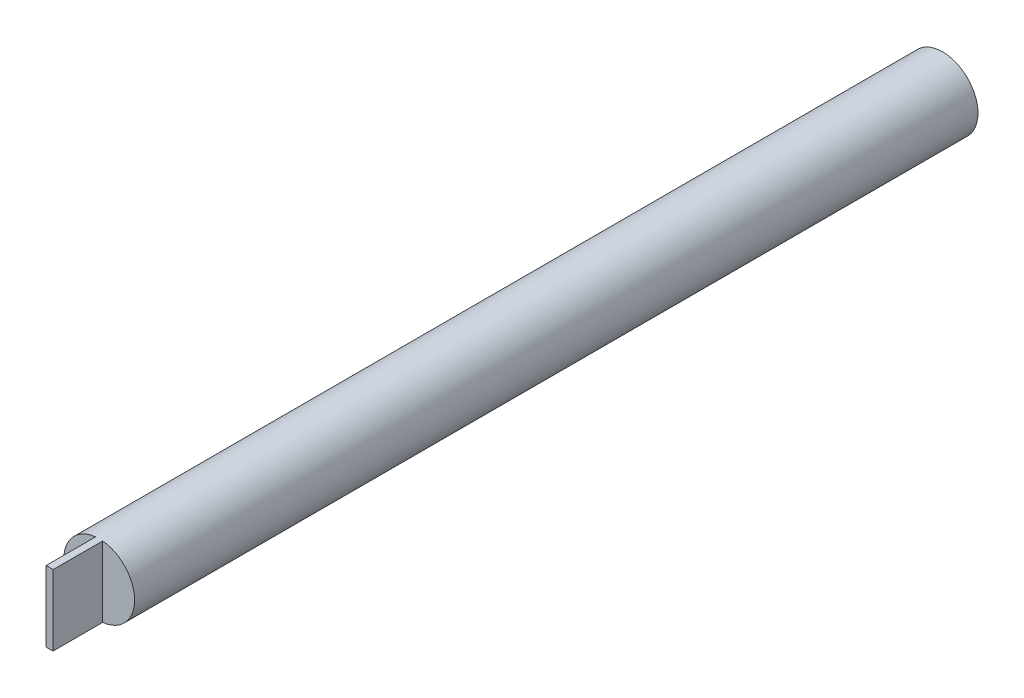
ISO-10303-21;
HEADER;
FILE_DESCRIPTION(('STEP AP214'),'2;1');
FILE_NAME('part.step','',(''),(''),'','','');
FILE_SCHEMA(('AUTOMOTIVE_DESIGN { 1 0 10303 214 1 1 1 1 }'));
ENDSEC;
DATA;
#1=APPLICATION_CONTEXT('core data for automotive mechanical design processes');
#2=APPLICATION_PROTOCOL_DEFINITION('international standard','automotive_design',2000,#1);
#3=PRODUCT_CONTEXT('',#1,'mechanical');
#4=PRODUCT('Part','Part','',(#3));
#5=PRODUCT_RELATED_PRODUCT_CATEGORY('part','',(#4));
#6=PRODUCT_DEFINITION_FORMATION('','',#4);
#7=PRODUCT_DEFINITION_CONTEXT('part definition',#1,'design');
#8=PRODUCT_DEFINITION('design','',#6,#7);
#9=PRODUCT_DEFINITION_SHAPE('','',#8);
#10=(LENGTH_UNIT() NAMED_UNIT(*) SI_UNIT(.MILLI.,.METRE.));
#11=(NAMED_UNIT(*) PLANE_ANGLE_UNIT() SI_UNIT($,.RADIAN.));
#12=(NAMED_UNIT(*) SI_UNIT($,.STERADIAN.) SOLID_ANGLE_UNIT());
#13=UNCERTAINTY_MEASURE_WITH_UNIT(LENGTH_MEASURE(1.E-05),#10,'distance_accuracy_value','');
#14=(GEOMETRIC_REPRESENTATION_CONTEXT(3) GLOBAL_UNCERTAINTY_ASSIGNED_CONTEXT((#13)) GLOBAL_UNIT_ASSIGNED_CONTEXT((#10,
#11,#12)) REPRESENTATION_CONTEXT('',''));
#15=CARTESIAN_POINT('',(0.,0.,0.));
#16=DIRECTION('',(0.,0.,1.));
#17=DIRECTION('',(1.,0.,0.));
#18=AXIS2_PLACEMENT_3D('',#15,#16,#17);
#19=CARTESIAN_POINT('',(0.,100.,63.));
#20=DIRECTION('',(0.,0.,-1.));
#21=DIRECTION('',(-1.,0.,0.));
#22=AXIS2_PLACEMENT_3D('',#19,#20,#21);
#23=CYLINDRICAL_SURFACE('',#22,5.);
#24=CARTESIAN_POINT('',(0.,100.,63.));
#25=DIRECTION('',(0.,0.,1.));
#26=DIRECTION('',(1.,0.,0.));
#27=AXIS2_PLACEMENT_3D('',#24,#25,#26);
#28=CIRCLE('',#27,5.);
#29=CARTESIAN_POINT('',(-0.499999999999999,95.0250628144669,63.));
#30=VERTEX_POINT('',#29);
#31=CARTESIAN_POINT('',(0.499999999999999,95.0250628144669,63.));
#32=VERTEX_POINT('',#31);
#33=EDGE_CURVE('E88',#30,#32,#28,.T.);
#34=ORIENTED_EDGE('',*,*,#33,.F.);
#35=DIRECTION('',(0.,0.,-1.));
#36=VECTOR('',#35,1.);
#37=CARTESIAN_POINT('',(-0.499999999999999,95.0250628144669,63.));
#38=LINE('',#37,#36);
#39=CARTESIAN_POINT('',(-0.499999999999999,95.0250628144669,56.));
#40=VERTEX_POINT('',#39);
#41=EDGE_CURVE('E48',#30,#40,#38,.T.);
#42=ORIENTED_EDGE('',*,*,#41,.T.);
#43=CARTESIAN_POINT('',(0.,100.,56.));
#44=DIRECTION('',(0.,0.,1.));
#45=DIRECTION('',(1.,0.,0.));
#46=AXIS2_PLACEMENT_3D('',#43,#44,#45);
#47=CIRCLE('',#46,5.);
#48=CARTESIAN_POINT('',(-0.5,104.974937185533,56.));
#49=VERTEX_POINT('',#48);
#50=EDGE_CURVE('E11',#49,#40,#47,.T.);
#51=ORIENTED_EDGE('',*,*,#50,.F.);
#52=DIRECTION('',(0.,0.,-1.));
#53=VECTOR('',#52,1.);
#54=CARTESIAN_POINT('',(-0.5,104.974937185533,63.));
#55=LINE('',#54,#53);
#56=CARTESIAN_POINT('',(-0.5,104.974937185533,63.));
#57=VERTEX_POINT('',#56);
#58=EDGE_CURVE('E104',#49,#57,#55,.F.);
#59=ORIENTED_EDGE('',*,*,#58,.T.);
#60=CARTESIAN_POINT('',(0.5,104.974937185533,63.));
#61=VERTEX_POINT('',#60);
#62=EDGE_CURVE('E82',#61,#57,#28,.T.);
#63=ORIENTED_EDGE('',*,*,#62,.F.);
#64=DIRECTION('',(0.,0.,-1.));
#65=VECTOR('',#64,1.);
#66=CARTESIAN_POINT('',(0.5,104.974937185533,63.));
#67=LINE('',#66,#65);
#68=CARTESIAN_POINT('',(0.5,104.974937185533,56.));
#69=VERTEX_POINT('',#68);
#70=EDGE_CURVE('E56',#61,#69,#67,.T.);
#71=ORIENTED_EDGE('',*,*,#70,.T.);
#72=CARTESIAN_POINT('',(0.,100.,56.));
#73=DIRECTION('',(0.,0.,1.));
#74=DIRECTION('',(1.,0.,0.));
#75=AXIS2_PLACEMENT_3D('',#72,#73,#74);
#76=CIRCLE('',#75,5.);
#77=CARTESIAN_POINT('',(0.499999999999999,95.0250628144669,56.));
#78=VERTEX_POINT('',#77);
#79=EDGE_CURVE('E41',#78,#69,#76,.T.);
#80=ORIENTED_EDGE('',*,*,#79,.F.);
#81=DIRECTION('',(0.,0.,-1.));
#82=VECTOR('',#81,1.);
#83=CARTESIAN_POINT('',(0.499999999999999,95.0250628144669,63.));
#84=LINE('',#83,#82);
#85=EDGE_CURVE('E75',#78,#32,#84,.F.);
#86=ORIENTED_EDGE('',*,*,#85,.T.);
#87=EDGE_LOOP('',(#34,#42,#51,#59,#63,#71,#80,#86));
#88=FACE_BOUND('',#87,.T.);
#89=CARTESIAN_POINT('',(0.,100.,-63.));
#90=DIRECTION('',(0.,0.,1.));
#91=DIRECTION('',(1.,0.,0.));
#92=AXIS2_PLACEMENT_3D('',#89,#90,#91);
#93=CIRCLE('',#92,5.);
#94=CARTESIAN_POINT('',(5.,100.,-63.));
#95=VERTEX_POINT('',#94);
#96=EDGE_CURVE('E92',#95,#95,#93,.T.);
#97=ORIENTED_EDGE('',*,*,#96,.T.);
#98=EDGE_LOOP('',(#97));
#99=FACE_BOUND('',#98,.T.);
#100=ADVANCED_FACE('F34',(#88,#99),#23,.T.);
#101=CARTESIAN_POINT('',(0.,100.,63.));
#102=DIRECTION('',(0.,0.,1.));
#103=DIRECTION('',(1.,0.,0.));
#104=AXIS2_PLACEMENT_3D('',#101,#102,#103);
#105=PLANE('',#104);
#106=DIRECTION('',(0.,1.,0.));
#107=VECTOR('',#106,1.);
#108=CARTESIAN_POINT('',(-0.499999999999999,100.,63.));
#109=LINE('',#108,#107);
#110=EDGE_CURVE('E81',#30,#57,#109,.T.);
#111=ORIENTED_EDGE('',*,*,#110,.F.);
#112=ORIENTED_EDGE('',*,*,#33,.T.);
#113=DIRECTION('',(0.,-1.,0.));
#114=VECTOR('',#113,1.);
#115=CARTESIAN_POINT('',(0.499999999999999,100.,63.));
#116=LINE('',#115,#114);
#117=EDGE_CURVE('E72',#61,#32,#116,.T.);
#118=ORIENTED_EDGE('',*,*,#117,.F.);
#119=ORIENTED_EDGE('',*,*,#62,.T.);
#120=EDGE_LOOP('',(#111,#112,#118,#119));
#121=FACE_BOUND('',#120,.T.);
#122=ADVANCED_FACE('F91',(#121),#105,.T.);
#123=CARTESIAN_POINT('',(0.,100.,-63.));
#124=DIRECTION('',(0.,0.,1.));
#125=DIRECTION('',(1.,0.,0.));
#126=AXIS2_PLACEMENT_3D('',#123,#124,#125);
#127=PLANE('',#126);
#128=ORIENTED_EDGE('',*,*,#96,.F.);
#129=EDGE_LOOP('',(#128));
#130=FACE_BOUND('',#129,.T.);
#131=ADVANCED_FACE('F123',(#130),#127,.F.);
#132=CARTESIAN_POINT('',(0.,0.,56.));
#133=DIRECTION('',(0.,0.,1.));
#134=DIRECTION('',(1.,0.,0.));
#135=AXIS2_PLACEMENT_3D('',#132,#133,#134);
#136=PLANE('',#135);
#137=ORIENTED_EDGE('',*,*,#79,.T.);
#138=DIRECTION('',(0.,-1.,0.));
#139=VECTOR('',#138,1.);
#140=CARTESIAN_POINT('',(0.5,107.,56.));
#141=LINE('',#140,#139);
#142=EDGE_CURVE('E101',#69,#78,#141,.T.);
#143=ORIENTED_EDGE('',*,*,#142,.T.);
#144=EDGE_LOOP('',(#137,#143));
#145=FACE_BOUND('',#144,.T.);
#146=ADVANCED_FACE('F100',(#145),#136,.T.);
#147=CARTESIAN_POINT('',(0.5,107.,56.));
#148=DIRECTION('',(-1.,0.,0.));
#149=DIRECTION('',(0.,-1.,0.));
#150=AXIS2_PLACEMENT_3D('',#147,#148,#149);
#151=PLANE('',#150);
#152=ORIENTED_EDGE('',*,*,#117,.T.);
#153=ORIENTED_EDGE('',*,*,#85,.F.);
#154=ORIENTED_EDGE('',*,*,#142,.F.);
#155=ORIENTED_EDGE('',*,*,#70,.F.);
#156=EDGE_LOOP('',(#152,#153,#154,#155));
#157=FACE_BOUND('',#156,.T.);
#158=ADVANCED_FACE('F74',(#157),#151,.F.);
#159=CARTESIAN_POINT('',(0.,0.,56.));
#160=DIRECTION('',(0.,0.,1.));
#161=DIRECTION('',(1.,0.,0.));
#162=AXIS2_PLACEMENT_3D('',#159,#160,#161);
#163=PLANE('',#162);
#164=ORIENTED_EDGE('',*,*,#50,.T.);
#165=DIRECTION('',(0.,1.,0.));
#166=VECTOR('',#165,1.);
#167=CARTESIAN_POINT('',(-0.5,107.,56.));
#168=LINE('',#167,#166);
#169=EDGE_CURVE('E89',#40,#49,#168,.T.);
#170=ORIENTED_EDGE('',*,*,#169,.T.);
#171=EDGE_LOOP('',(#164,#170));
#172=FACE_BOUND('',#171,.T.);
#173=ADVANCED_FACE('F110',(#172),#163,.T.);
#174=CARTESIAN_POINT('',(-0.5,107.,56.));
#175=DIRECTION('',(1.,0.,0.));
#176=DIRECTION('',(0.,1.,0.));
#177=AXIS2_PLACEMENT_3D('',#174,#175,#176);
#178=PLANE('',#177);
#179=ORIENTED_EDGE('',*,*,#110,.T.);
#180=ORIENTED_EDGE('',*,*,#58,.F.);
#181=ORIENTED_EDGE('',*,*,#169,.F.);
#182=ORIENTED_EDGE('',*,*,#41,.F.);
#183=EDGE_LOOP('',(#179,#180,#181,#182));
#184=FACE_BOUND('',#183,.T.);
#185=ADVANCED_FACE('F111',(#184),#178,.F.);
#186=CLOSED_SHELL('',(#100,#122,#131,#146,#158,#173,#185));
#187=MANIFOLD_SOLID_BREP('B2',#186);
#188=ADVANCED_BREP_SHAPE_REPRESENTATION('',(#18,#187),#14);
#189=SHAPE_DEFINITION_REPRESENTATION(#9,#188);
ENDSEC;
END-ISO-10303-21;
